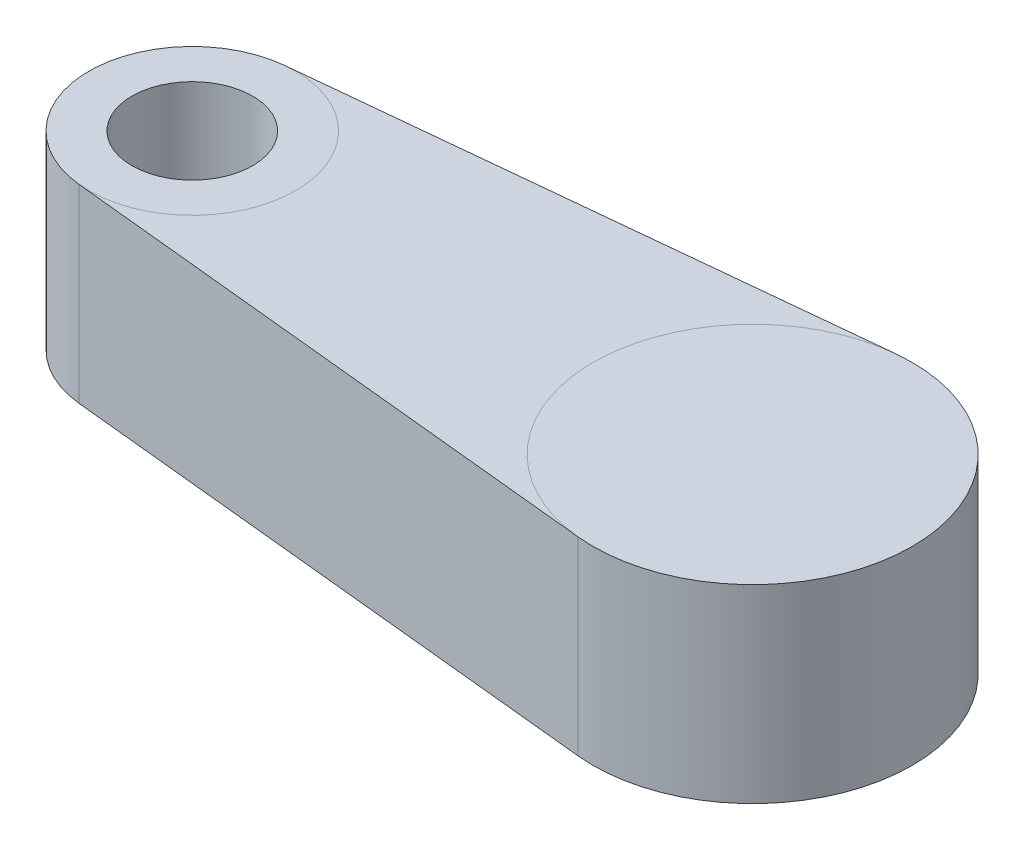
ISO-10303-21;
HEADER;
FILE_DESCRIPTION(('STEP AP214'),'2;1');
FILE_NAME('part.step','',(''),(''),'','','');
FILE_SCHEMA(('AUTOMOTIVE_DESIGN { 1 0 10303 214 1 1 1 1 }'));
ENDSEC;
DATA;
#1=APPLICATION_CONTEXT('core data for automotive mechanical design processes');
#2=APPLICATION_PROTOCOL_DEFINITION('international standard','automotive_design',2000,#1);
#3=PRODUCT_CONTEXT('',#1,'mechanical');
#4=PRODUCT('Part','Part','',(#3));
#5=PRODUCT_RELATED_PRODUCT_CATEGORY('part','',(#4));
#6=PRODUCT_DEFINITION_FORMATION('','',#4);
#7=PRODUCT_DEFINITION_CONTEXT('part definition',#1,'design');
#8=PRODUCT_DEFINITION('design','',#6,#7);
#9=PRODUCT_DEFINITION_SHAPE('','',#8);
#10=(LENGTH_UNIT() NAMED_UNIT(*) SI_UNIT(.MILLI.,.METRE.));
#11=(NAMED_UNIT(*) PLANE_ANGLE_UNIT() SI_UNIT($,.RADIAN.));
#12=(NAMED_UNIT(*) SI_UNIT($,.STERADIAN.) SOLID_ANGLE_UNIT());
#13=UNCERTAINTY_MEASURE_WITH_UNIT(LENGTH_MEASURE(1.E-05),#10,'distance_accuracy_value','');
#14=(GEOMETRIC_REPRESENTATION_CONTEXT(3) GLOBAL_UNCERTAINTY_ASSIGNED_CONTEXT((#13)) GLOBAL_UNIT_ASSIGNED_CONTEXT((#10,
#11,#12)) REPRESENTATION_CONTEXT('',''));
#15=CARTESIAN_POINT('',(0.,0.,0.));
#16=DIRECTION('',(0.,0.,1.));
#17=DIRECTION('',(1.,0.,0.));
#18=AXIS2_PLACEMENT_3D('',#15,#16,#17);
#19=CARTESIAN_POINT('',(0.,34.925,0.));
#20=DIRECTION('',(0.,1.,0.));
#21=DIRECTION('',(0.,0.,1.));
#22=AXIS2_PLACEMENT_3D('',#19,#20,#21);
#23=PLANE('',#22);
#24=CARTESIAN_POINT('',(0.,34.925,0.));
#25=DIRECTION('',(0.,1.,0.));
#26=DIRECTION('',(0.,0.,1.));
#27=AXIS2_PLACEMENT_3D('',#24,#25,#26);
#28=CIRCLE('',#27,19.05);
#29=CARTESIAN_POINT('',(-1.905,34.925,-18.9545106768811));
#30=VERTEX_POINT('',#29);
#31=CARTESIAN_POINT('',(-1.905,34.925,18.9545106768811));
#32=VERTEX_POINT('',#31);
#33=EDGE_CURVE('E12',#30,#32,#28,.F.);
#34=ORIENTED_EDGE('',*,*,#33,.F.);
#35=CARTESIAN_POINT('',(0.,34.925,0.));
#36=DIRECTION('',(0.,1.,0.));
#37=DIRECTION('',(0.,0.,1.));
#38=AXIS2_PLACEMENT_3D('',#35,#36,#37);
#39=CIRCLE('',#38,19.05);
#40=EDGE_CURVE('E128',#30,#32,#39,.T.);
#41=ORIENTED_EDGE('',*,*,#40,.T.);
#42=EDGE_LOOP('',(#34,#41));
#43=FACE_BOUND('',#42,.T.);
#44=CARTESIAN_POINT('',(0.,34.925,0.));
#45=DIRECTION('',(0.,1.,0.));
#46=DIRECTION('',(0.,0.,1.));
#47=AXIS2_PLACEMENT_3D('',#44,#45,#46);
#48=CIRCLE('',#47,11.1125);
#49=CARTESIAN_POINT('',(0.,34.925,11.1125));
#50=VERTEX_POINT('',#49);
#51=EDGE_CURVE('E137',#50,#50,#48,.T.);
#52=ORIENTED_EDGE('',*,*,#51,.F.);
#53=EDGE_LOOP('',(#52));
#54=FACE_BOUND('',#53,.T.);
#55=ADVANCED_FACE('F50',(#43,#54),#23,.T.);
#56=DIRECTION('',(0.99498743710662,0.,-0.1));
#57=VECTOR('',#56,1.);
#58=CARTESIAN_POINT('',(-1.905,34.925,-18.9545106768811));
#59=LINE('',#58,#57);
#60=CARTESIAN_POINT('',(100.250625,34.925,-29.221537293525));
#61=VERTEX_POINT('',#60);
#62=EDGE_CURVE('E121',#30,#61,#59,.T.);
#63=ORIENTED_EDGE('',*,*,#62,.F.);
#64=ORIENTED_EDGE('',*,*,#33,.T.);
#65=DIRECTION('',(0.99498743710662,0.,0.1));
#66=VECTOR('',#65,1.);
#67=CARTESIAN_POINT('',(-1.905,34.925,18.9545106768811));
#68=LINE('',#67,#66);
#69=CARTESIAN_POINT('',(100.250625,34.925,29.221537293525));
#70=VERTEX_POINT('',#69);
#71=EDGE_CURVE('E106',#32,#70,#68,.T.);
#72=ORIENTED_EDGE('',*,*,#71,.T.);
#73=CARTESIAN_POINT('',(103.1875,34.925,0.));
#74=DIRECTION('',(0.,1.,0.));
#75=DIRECTION('',(0.,0.,1.));
#76=AXIS2_PLACEMENT_3D('',#73,#74,#75);
#77=CIRCLE('',#76,29.36875);
#78=EDGE_CURVE('E60',#70,#61,#77,.F.);
#79=ORIENTED_EDGE('',*,*,#78,.T.);
#80=EDGE_LOOP('',(#63,#64,#72,#79));
#81=FACE_BOUND('',#80,.T.);
#82=ADVANCED_FACE('F108',(#81),#23,.T.);
#83=CARTESIAN_POINT('',(-1.905,34.925,18.9545106768811));
#84=DIRECTION('',(0.1,0.,-0.99498743710662));
#85=DIRECTION('',(-0.99498743710662,0.,-0.1));
#86=AXIS2_PLACEMENT_3D('',#83,#84,#85);
#87=PLANE('',#86);
#88=DIRECTION('',(0.99498743710662,0.,0.1));
#89=VECTOR('',#88,1.);
#90=CARTESIAN_POINT('',(-1.905,0.,18.9545106768811));
#91=LINE('',#90,#89);
#92=CARTESIAN_POINT('',(-1.905,0.,18.9545106768811));
#93=VERTEX_POINT('',#92);
#94=CARTESIAN_POINT('',(100.250625,0.,29.221537293525));
#95=VERTEX_POINT('',#94);
#96=EDGE_CURVE('E116',#93,#95,#91,.T.);
#97=ORIENTED_EDGE('',*,*,#96,.T.);
#98=DIRECTION('',(0.,-1.,0.));
#99=VECTOR('',#98,1.);
#100=CARTESIAN_POINT('',(100.250625,34.925,29.221537293525));
#101=LINE('',#100,#99);
#102=EDGE_CURVE('E113',#70,#95,#101,.T.);
#103=ORIENTED_EDGE('',*,*,#102,.F.);
#104=ORIENTED_EDGE('',*,*,#71,.F.);
#105=DIRECTION('',(0.,-1.,0.));
#106=VECTOR('',#105,1.);
#107=CARTESIAN_POINT('',(-1.905,34.925,18.9545106768811));
#108=LINE('',#107,#106);
#109=EDGE_CURVE('E104',#32,#93,#108,.T.);
#110=ORIENTED_EDGE('',*,*,#109,.T.);
#111=EDGE_LOOP('',(#97,#103,#104,#110));
#112=FACE_BOUND('',#111,.T.);
#113=ADVANCED_FACE('F114',(#112),#87,.F.);
#114=CARTESIAN_POINT('',(103.1875,34.925,0.));
#115=DIRECTION('',(0.,-1.,0.));
#116=DIRECTION('',(0.,0.,-1.));
#117=AXIS2_PLACEMENT_3D('',#114,#115,#116);
#118=CYLINDRICAL_SURFACE('',#117,29.36875);
#119=CARTESIAN_POINT('',(103.1875,0.,0.));
#120=DIRECTION('',(0.,1.,0.));
#121=DIRECTION('',(0.,0.,1.));
#122=AXIS2_PLACEMENT_3D('',#119,#120,#121);
#123=CIRCLE('',#122,29.36875);
#124=CARTESIAN_POINT('',(100.250625,0.,-29.221537293525));
#125=VERTEX_POINT('',#124);
#126=EDGE_CURVE('E127',#95,#125,#123,.T.);
#127=ORIENTED_EDGE('',*,*,#126,.T.);
#128=DIRECTION('',(0.,-1.,0.));
#129=VECTOR('',#128,1.);
#130=CARTESIAN_POINT('',(100.250625,34.925,-29.221537293525));
#131=LINE('',#130,#129);
#132=EDGE_CURVE('E83',#61,#125,#131,.T.);
#133=ORIENTED_EDGE('',*,*,#132,.F.);
#134=CARTESIAN_POINT('',(103.1875,34.925,0.));
#135=DIRECTION('',(0.,1.,0.));
#136=DIRECTION('',(0.,0.,1.));
#137=AXIS2_PLACEMENT_3D('',#134,#135,#136);
#138=CIRCLE('',#137,29.36875);
#139=EDGE_CURVE('E102',#70,#61,#138,.T.);
#140=ORIENTED_EDGE('',*,*,#139,.F.);
#141=ORIENTED_EDGE('',*,*,#102,.T.);
#142=EDGE_LOOP('',(#127,#133,#140,#141));
#143=FACE_BOUND('',#142,.T.);
#144=ADVANCED_FACE('F120',(#143),#118,.T.);
#145=CARTESIAN_POINT('',(-1.905,34.925,-18.9545106768811));
#146=DIRECTION('',(-0.1,0.,-0.99498743710662));
#147=DIRECTION('',(-0.99498743710662,0.,0.1));
#148=AXIS2_PLACEMENT_3D('',#145,#146,#147);
#149=PLANE('',#148);
#150=DIRECTION('',(0.99498743710662,0.,-0.1));
#151=VECTOR('',#150,1.);
#152=CARTESIAN_POINT('',(-1.905,0.,-18.9545106768811));
#153=LINE('',#152,#151);
#154=CARTESIAN_POINT('',(-1.905,0.,-18.9545106768811));
#155=VERTEX_POINT('',#154);
#156=EDGE_CURVE('E110',#155,#125,#153,.T.);
#157=ORIENTED_EDGE('',*,*,#156,.F.);
#158=DIRECTION('',(0.,-1.,0.));
#159=VECTOR('',#158,1.);
#160=CARTESIAN_POINT('',(-1.905,34.925,-18.9545106768811));
#161=LINE('',#160,#159);
#162=EDGE_CURVE('E90',#30,#155,#161,.T.);
#163=ORIENTED_EDGE('',*,*,#162,.F.);
#164=ORIENTED_EDGE('',*,*,#62,.T.);
#165=ORIENTED_EDGE('',*,*,#132,.T.);
#166=EDGE_LOOP('',(#157,#163,#164,#165));
#167=FACE_BOUND('',#166,.T.);
#168=ADVANCED_FACE('F169',(#167),#149,.T.);
#169=CARTESIAN_POINT('',(0.,0.,0.));
#170=DIRECTION('',(0.,1.,0.));
#171=DIRECTION('',(0.,0.,1.));
#172=AXIS2_PLACEMENT_3D('',#169,#170,#171);
#173=PLANE('',#172);
#174=CARTESIAN_POINT('',(0.,0.,0.));
#175=DIRECTION('',(0.,1.,0.));
#176=DIRECTION('',(0.,0.,1.));
#177=AXIS2_PLACEMENT_3D('',#174,#175,#176);
#178=CIRCLE('',#177,11.1125);
#179=CARTESIAN_POINT('',(0.,0.,11.1125));
#180=VERTEX_POINT('',#179);
#181=EDGE_CURVE('E140',#180,#180,#178,.T.);
#182=ORIENTED_EDGE('',*,*,#181,.T.);
#183=EDGE_LOOP('',(#182));
#184=FACE_BOUND('',#183,.T.);
#185=ORIENTED_EDGE('',*,*,#96,.F.);
#186=CARTESIAN_POINT('',(0.,0.,0.));
#187=DIRECTION('',(0.,1.,0.));
#188=DIRECTION('',(0.,0.,1.));
#189=AXIS2_PLACEMENT_3D('',#186,#187,#188);
#190=CIRCLE('',#189,19.05);
#191=EDGE_CURVE('E136',#155,#93,#190,.T.);
#192=ORIENTED_EDGE('',*,*,#191,.F.);
#193=ORIENTED_EDGE('',*,*,#156,.T.);
#194=ORIENTED_EDGE('',*,*,#126,.F.);
#195=EDGE_LOOP('',(#185,#192,#193,#194));
#196=FACE_BOUND('',#195,.T.);
#197=ADVANCED_FACE('F149',(#184,#196),#173,.F.);
#198=ORIENTED_EDGE('',*,*,#78,.F.);
#199=ORIENTED_EDGE('',*,*,#139,.T.);
#200=EDGE_LOOP('',(#198,#199));
#201=FACE_BOUND('',#200,.T.);
#202=ADVANCED_FACE('F100',(#201),#23,.T.);
#203=CARTESIAN_POINT('',(0.,34.925,0.));
#204=DIRECTION('',(0.,-1.,0.));
#205=DIRECTION('',(0.,0.,-1.));
#206=AXIS2_PLACEMENT_3D('',#203,#204,#205);
#207=CYLINDRICAL_SURFACE('',#206,19.05);
#208=ORIENTED_EDGE('',*,*,#191,.T.);
#209=ORIENTED_EDGE('',*,*,#109,.F.);
#210=ORIENTED_EDGE('',*,*,#40,.F.);
#211=ORIENTED_EDGE('',*,*,#162,.T.);
#212=EDGE_LOOP('',(#208,#209,#210,#211));
#213=FACE_BOUND('',#212,.T.);
#214=ADVANCED_FACE('F52',(#213),#207,.T.);
#215=CARTESIAN_POINT('',(0.,34.925,0.));
#216=DIRECTION('',(0.,-1.,0.));
#217=DIRECTION('',(0.,0.,-1.));
#218=AXIS2_PLACEMENT_3D('',#215,#216,#217);
#219=CYLINDRICAL_SURFACE('',#218,11.1125);
#220=ORIENTED_EDGE('',*,*,#51,.T.);
#221=EDGE_LOOP('',(#220));
#222=FACE_BOUND('',#221,.T.);
#223=ORIENTED_EDGE('',*,*,#181,.F.);
#224=EDGE_LOOP('',(#223));
#225=FACE_BOUND('',#224,.T.);
#226=ADVANCED_FACE('F152',(#222,#225),#219,.F.);
#227=CLOSED_SHELL('',(#55,#82,#113,#144,#168,#197,#202,#214,#226));
#228=MANIFOLD_SOLID_BREP('B2',#227);
#229=ADVANCED_BREP_SHAPE_REPRESENTATION('',(#18,#228),#14);
#230=SHAPE_DEFINITION_REPRESENTATION(#9,#229);
ENDSEC;
END-ISO-10303-21;
